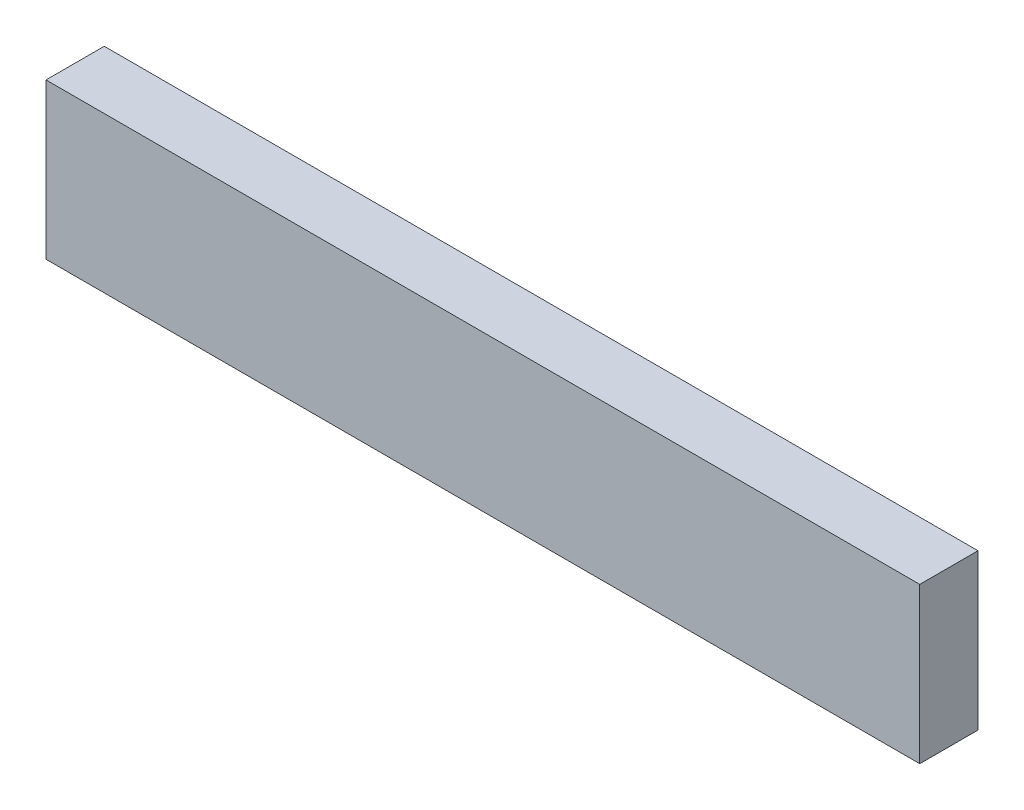
ISO-10303-21;
HEADER;
FILE_DESCRIPTION(('STEP AP214'),'2;1');
FILE_NAME('part.step','',(''),(''),'','','');
FILE_SCHEMA(('AUTOMOTIVE_DESIGN { 1 0 10303 214 1 1 1 1 }'));
ENDSEC;
DATA;
#1=APPLICATION_CONTEXT('core data for automotive mechanical design processes');
#2=APPLICATION_PROTOCOL_DEFINITION('international standard','automotive_design',2000,#1);
#3=PRODUCT_CONTEXT('',#1,'mechanical');
#4=PRODUCT('Part','Part','',(#3));
#5=PRODUCT_RELATED_PRODUCT_CATEGORY('part','',(#4));
#6=PRODUCT_DEFINITION_FORMATION('','',#4);
#7=PRODUCT_DEFINITION_CONTEXT('part definition',#1,'design');
#8=PRODUCT_DEFINITION('design','',#6,#7);
#9=PRODUCT_DEFINITION_SHAPE('','',#8);
#10=(LENGTH_UNIT() NAMED_UNIT(*) SI_UNIT(.MILLI.,.METRE.));
#11=(NAMED_UNIT(*) PLANE_ANGLE_UNIT() SI_UNIT($,.RADIAN.));
#12=(NAMED_UNIT(*) SI_UNIT($,.STERADIAN.) SOLID_ANGLE_UNIT());
#13=UNCERTAINTY_MEASURE_WITH_UNIT(LENGTH_MEASURE(1.E-05),#10,'distance_accuracy_value','');
#14=(GEOMETRIC_REPRESENTATION_CONTEXT(3) GLOBAL_UNCERTAINTY_ASSIGNED_CONTEXT((#13)) GLOBAL_UNIT_ASSIGNED_CONTEXT((#10,
#11,#12)) REPRESENTATION_CONTEXT('',''));
#15=CARTESIAN_POINT('',(0.,0.,0.));
#16=DIRECTION('',(0.,0.,1.));
#17=DIRECTION('',(1.,0.,0.));
#18=AXIS2_PLACEMENT_3D('',#15,#16,#17);
#19=CARTESIAN_POINT('',(0.,0.,3.));
#20=DIRECTION('',(1.,0.,0.));
#21=DIRECTION('',(0.,0.,-1.));
#22=AXIS2_PLACEMENT_3D('',#19,#20,#21);
#23=PLANE('',#22);
#24=DIRECTION('',(0.,-1.,0.));
#25=VECTOR('',#24,1.);
#26=CARTESIAN_POINT('',(0.,0.,0.));
#27=LINE('',#26,#25);
#28=CARTESIAN_POINT('',(0.,8.,0.));
#29=VERTEX_POINT('',#28);
#30=CARTESIAN_POINT('',(0.,0.,0.));
#31=VERTEX_POINT('',#30);
#32=EDGE_CURVE('E98',#29,#31,#27,.T.);
#33=ORIENTED_EDGE('',*,*,#32,.T.);
#34=DIRECTION('',(0.,0.,-1.));
#35=VECTOR('',#34,1.);
#36=CARTESIAN_POINT('',(0.,0.,3.));
#37=LINE('',#36,#35);
#38=CARTESIAN_POINT('',(0.,0.,3.));
#39=VERTEX_POINT('',#38);
#40=EDGE_CURVE('E11',#39,#31,#37,.T.);
#41=ORIENTED_EDGE('',*,*,#40,.F.);
#42=DIRECTION('',(0.,-1.,0.));
#43=VECTOR('',#42,1.);
#44=CARTESIAN_POINT('',(0.,0.,3.));
#45=LINE('',#44,#43);
#46=CARTESIAN_POINT('',(0.,8.,3.));
#47=VERTEX_POINT('',#46);
#48=EDGE_CURVE('E86',#47,#39,#45,.T.);
#49=ORIENTED_EDGE('',*,*,#48,.F.);
#50=DIRECTION('',(0.,0.,-1.));
#51=VECTOR('',#50,1.);
#52=CARTESIAN_POINT('',(0.,8.,3.));
#53=LINE('',#52,#51);
#54=EDGE_CURVE('E94',#47,#29,#53,.T.);
#55=ORIENTED_EDGE('',*,*,#54,.T.);
#56=EDGE_LOOP('',(#33,#41,#49,#55));
#57=FACE_BOUND('',#56,.T.);
#58=ADVANCED_FACE('F35',(#57),#23,.F.);
#59=CARTESIAN_POINT('',(0.,0.,3.));
#60=DIRECTION('',(0.,1.,0.));
#61=DIRECTION('',(0.,0.,1.));
#62=AXIS2_PLACEMENT_3D('',#59,#60,#61);
#63=PLANE('',#62);
#64=DIRECTION('',(1.,0.,0.));
#65=VECTOR('',#64,1.);
#66=CARTESIAN_POINT('',(0.,0.,0.));
#67=LINE('',#66,#65);
#68=CARTESIAN_POINT('',(45.,0.,0.));
#69=VERTEX_POINT('',#68);
#70=EDGE_CURVE('E90',#31,#69,#67,.T.);
#71=ORIENTED_EDGE('',*,*,#70,.T.);
#72=DIRECTION('',(0.,0.,-1.));
#73=VECTOR('',#72,1.);
#74=CARTESIAN_POINT('',(45.,0.,3.));
#75=LINE('',#74,#73);
#76=CARTESIAN_POINT('',(45.,0.,3.));
#77=VERTEX_POINT('',#76);
#78=EDGE_CURVE('E43',#77,#69,#75,.T.);
#79=ORIENTED_EDGE('',*,*,#78,.F.);
#80=DIRECTION('',(1.,0.,0.));
#81=VECTOR('',#80,1.);
#82=CARTESIAN_POINT('',(0.,0.,3.));
#83=LINE('',#82,#81);
#84=EDGE_CURVE('E81',#39,#77,#83,.T.);
#85=ORIENTED_EDGE('',*,*,#84,.F.);
#86=ORIENTED_EDGE('',*,*,#40,.T.);
#87=EDGE_LOOP('',(#71,#79,#85,#86));
#88=FACE_BOUND('',#87,.T.);
#89=ADVANCED_FACE('F89',(#88),#63,.F.);
#90=CARTESIAN_POINT('',(45.,0.,3.));
#91=DIRECTION('',(-1.,0.,0.));
#92=DIRECTION('',(0.,0.,1.));
#93=AXIS2_PLACEMENT_3D('',#90,#91,#92);
#94=PLANE('',#93);
#95=DIRECTION('',(0.,1.,0.));
#96=VECTOR('',#95,1.);
#97=CARTESIAN_POINT('',(45.,0.,0.));
#98=LINE('',#97,#96);
#99=CARTESIAN_POINT('',(45.,8.,0.));
#100=VERTEX_POINT('',#99);
#101=EDGE_CURVE('E68',#69,#100,#98,.T.);
#102=ORIENTED_EDGE('',*,*,#101,.T.);
#103=DIRECTION('',(0.,0.,-1.));
#104=VECTOR('',#103,1.);
#105=CARTESIAN_POINT('',(45.,8.,3.));
#106=LINE('',#105,#104);
#107=CARTESIAN_POINT('',(45.,8.,3.));
#108=VERTEX_POINT('',#107);
#109=EDGE_CURVE('E91',#108,#100,#106,.T.);
#110=ORIENTED_EDGE('',*,*,#109,.F.);
#111=DIRECTION('',(0.,1.,0.));
#112=VECTOR('',#111,1.);
#113=CARTESIAN_POINT('',(45.,0.,3.));
#114=LINE('',#113,#112);
#115=EDGE_CURVE('E84',#77,#108,#114,.T.);
#116=ORIENTED_EDGE('',*,*,#115,.F.);
#117=ORIENTED_EDGE('',*,*,#78,.T.);
#118=EDGE_LOOP('',(#102,#110,#116,#117));
#119=FACE_BOUND('',#118,.T.);
#120=ADVANCED_FACE('F92',(#119),#94,.F.);
#121=CARTESIAN_POINT('',(0.,8.,3.));
#122=DIRECTION('',(0.,-1.,0.));
#123=DIRECTION('',(0.,0.,-1.));
#124=AXIS2_PLACEMENT_3D('',#121,#122,#123);
#125=PLANE('',#124);
#126=DIRECTION('',(-1.,0.,0.));
#127=VECTOR('',#126,1.);
#128=CARTESIAN_POINT('',(0.,8.,0.));
#129=LINE('',#128,#127);
#130=EDGE_CURVE('E74',#100,#29,#129,.T.);
#131=ORIENTED_EDGE('',*,*,#130,.T.);
#132=ORIENTED_EDGE('',*,*,#54,.F.);
#133=DIRECTION('',(-1.,0.,0.));
#134=VECTOR('',#133,1.);
#135=CARTESIAN_POINT('',(0.,8.,3.));
#136=LINE('',#135,#134);
#137=EDGE_CURVE('E51',#108,#47,#136,.T.);
#138=ORIENTED_EDGE('',*,*,#137,.F.);
#139=ORIENTED_EDGE('',*,*,#109,.T.);
#140=EDGE_LOOP('',(#131,#132,#138,#139));
#141=FACE_BOUND('',#140,.T.);
#142=ADVANCED_FACE('F105',(#141),#125,.F.);
#143=CARTESIAN_POINT('',(0.,0.,3.));
#144=DIRECTION('',(0.,0.,-1.));
#145=DIRECTION('',(-1.,0.,0.));
#146=AXIS2_PLACEMENT_3D('',#143,#144,#145);
#147=PLANE('',#146);
#148=ORIENTED_EDGE('',*,*,#48,.T.);
#149=ORIENTED_EDGE('',*,*,#84,.T.);
#150=ORIENTED_EDGE('',*,*,#115,.T.);
#151=ORIENTED_EDGE('',*,*,#137,.T.);
#152=EDGE_LOOP('',(#148,#149,#150,#151));
#153=FACE_BOUND('',#152,.T.);
#154=ADVANCED_FACE('F82',(#153),#147,.F.);
#155=CARTESIAN_POINT('',(0.,0.,0.));
#156=DIRECTION('',(0.,0.,-1.));
#157=DIRECTION('',(-1.,0.,0.));
#158=AXIS2_PLACEMENT_3D('',#155,#156,#157);
#159=PLANE('',#158);
#160=ORIENTED_EDGE('',*,*,#32,.F.);
#161=ORIENTED_EDGE('',*,*,#130,.F.);
#162=ORIENTED_EDGE('',*,*,#101,.F.);
#163=ORIENTED_EDGE('',*,*,#70,.F.);
#164=EDGE_LOOP('',(#160,#161,#162,#163));
#165=FACE_BOUND('',#164,.T.);
#166=ADVANCED_FACE('F108',(#165),#159,.T.);
#167=CLOSED_SHELL('',(#58,#89,#120,#142,#154,#166));
#168=MANIFOLD_SOLID_BREP('B2',#167);
#169=ADVANCED_BREP_SHAPE_REPRESENTATION('',(#18,#168),#14);
#170=SHAPE_DEFINITION_REPRESENTATION(#9,#169);
ENDSEC;
END-ISO-10303-21;
